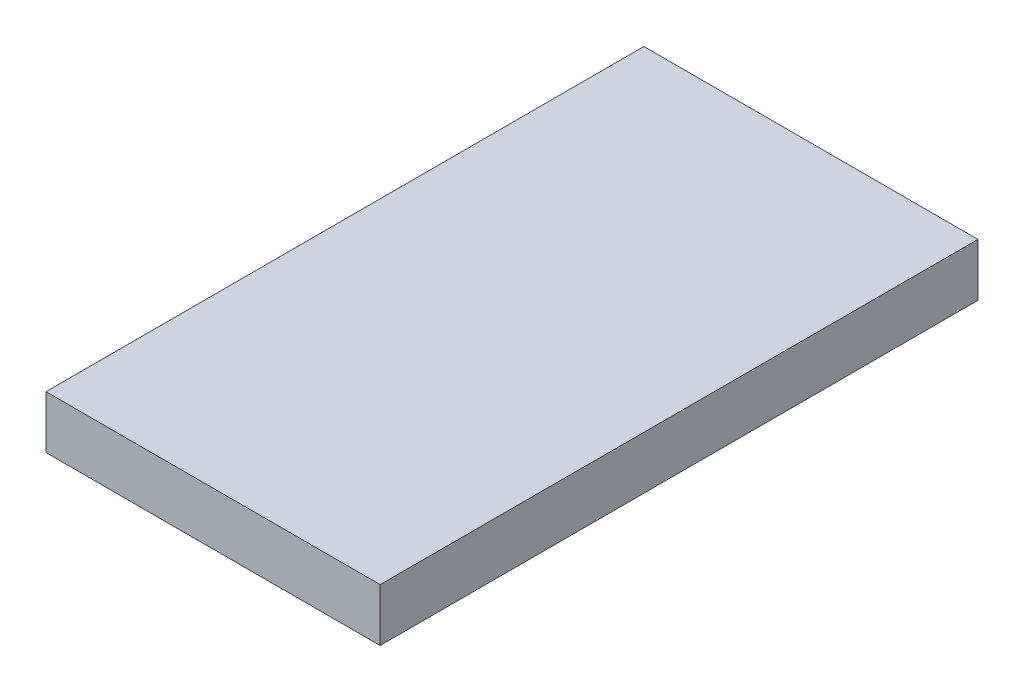
ISO-10303-21;
HEADER;
FILE_DESCRIPTION(('STEP AP214'),'2;1');
FILE_NAME('part.step','',(''),(''),'','','');
FILE_SCHEMA(('AUTOMOTIVE_DESIGN { 1 0 10303 214 1 1 1 1 }'));
ENDSEC;
DATA;
#1=APPLICATION_CONTEXT('core data for automotive mechanical design processes');
#2=APPLICATION_PROTOCOL_DEFINITION('international standard','automotive_design',2000,#1);
#3=PRODUCT_CONTEXT('',#1,'mechanical');
#4=PRODUCT('Part','Part','',(#3));
#5=PRODUCT_RELATED_PRODUCT_CATEGORY('part','',(#4));
#6=PRODUCT_DEFINITION_FORMATION('','',#4);
#7=PRODUCT_DEFINITION_CONTEXT('part definition',#1,'design');
#8=PRODUCT_DEFINITION('design','',#6,#7);
#9=PRODUCT_DEFINITION_SHAPE('','',#8);
#10=(LENGTH_UNIT() NAMED_UNIT(*) SI_UNIT(.MILLI.,.METRE.));
#11=(NAMED_UNIT(*) PLANE_ANGLE_UNIT() SI_UNIT($,.RADIAN.));
#12=(NAMED_UNIT(*) SI_UNIT($,.STERADIAN.) SOLID_ANGLE_UNIT());
#13=UNCERTAINTY_MEASURE_WITH_UNIT(LENGTH_MEASURE(1.E-05),#10,'distance_accuracy_value','');
#14=(GEOMETRIC_REPRESENTATION_CONTEXT(3) GLOBAL_UNCERTAINTY_ASSIGNED_CONTEXT((#13)) GLOBAL_UNIT_ASSIGNED_CONTEXT((#10,
#11,#12)) REPRESENTATION_CONTEXT('',''));
#15=CARTESIAN_POINT('',(0.,0.,0.));
#16=DIRECTION('',(0.,0.,1.));
#17=DIRECTION('',(1.,0.,0.));
#18=AXIS2_PLACEMENT_3D('',#15,#16,#17);
#19=CARTESIAN_POINT('',(0.,19.05,0.));
#20=DIRECTION('',(1.,0.,0.));
#21=DIRECTION('',(0.,0.,-1.));
#22=AXIS2_PLACEMENT_3D('',#19,#20,#21);
#23=PLANE('',#22);
#24=DIRECTION('',(0.,0.,1.));
#25=VECTOR('',#24,1.);
#26=CARTESIAN_POINT('',(0.,0.,0.));
#27=LINE('',#26,#25);
#28=CARTESIAN_POINT('',(0.,0.,-215.9));
#29=VERTEX_POINT('',#28);
#30=CARTESIAN_POINT('',(0.,0.,0.));
#31=VERTEX_POINT('',#30);
#32=EDGE_CURVE('E96',#29,#31,#27,.T.);
#33=ORIENTED_EDGE('',*,*,#32,.T.);
#34=DIRECTION('',(0.,-1.,0.));
#35=VECTOR('',#34,1.);
#36=CARTESIAN_POINT('',(0.,19.05,0.));
#37=LINE('',#36,#35);
#38=CARTESIAN_POINT('',(0.,19.05,0.));
#39=VERTEX_POINT('',#38);
#40=EDGE_CURVE('E11',#39,#31,#37,.T.);
#41=ORIENTED_EDGE('',*,*,#40,.F.);
#42=DIRECTION('',(0.,0.,1.));
#43=VECTOR('',#42,1.);
#44=CARTESIAN_POINT('',(0.,19.05,0.));
#45=LINE('',#44,#43);
#46=CARTESIAN_POINT('',(0.,19.05,-215.9));
#47=VERTEX_POINT('',#46);
#48=EDGE_CURVE('E84',#47,#39,#45,.T.);
#49=ORIENTED_EDGE('',*,*,#48,.F.);
#50=DIRECTION('',(0.,-1.,0.));
#51=VECTOR('',#50,1.);
#52=CARTESIAN_POINT('',(0.,19.05,-215.9));
#53=LINE('',#52,#51);
#54=EDGE_CURVE('E92',#47,#29,#53,.T.);
#55=ORIENTED_EDGE('',*,*,#54,.T.);
#56=EDGE_LOOP('',(#33,#41,#49,#55));
#57=FACE_BOUND('',#56,.T.);
#58=ADVANCED_FACE('F33',(#57),#23,.F.);
#59=CARTESIAN_POINT('',(0.,19.05,0.));
#60=DIRECTION('',(0.,0.,-1.));
#61=DIRECTION('',(-1.,0.,0.));
#62=AXIS2_PLACEMENT_3D('',#59,#60,#61);
#63=PLANE('',#62);
#64=DIRECTION('',(1.,0.,0.));
#65=VECTOR('',#64,1.);
#66=CARTESIAN_POINT('',(0.,0.,0.));
#67=LINE('',#66,#65);
#68=CARTESIAN_POINT('',(120.65,0.,0.));
#69=VERTEX_POINT('',#68);
#70=EDGE_CURVE('E88',#31,#69,#67,.T.);
#71=ORIENTED_EDGE('',*,*,#70,.T.);
#72=DIRECTION('',(0.,-1.,0.));
#73=VECTOR('',#72,1.);
#74=CARTESIAN_POINT('',(120.65,19.05,0.));
#75=LINE('',#74,#73);
#76=CARTESIAN_POINT('',(120.65,19.05,0.));
#77=VERTEX_POINT('',#76);
#78=EDGE_CURVE('E41',#77,#69,#75,.T.);
#79=ORIENTED_EDGE('',*,*,#78,.F.);
#80=DIRECTION('',(1.,0.,0.));
#81=VECTOR('',#80,1.);
#82=CARTESIAN_POINT('',(0.,19.05,0.));
#83=LINE('',#82,#81);
#84=EDGE_CURVE('E79',#39,#77,#83,.T.);
#85=ORIENTED_EDGE('',*,*,#84,.F.);
#86=ORIENTED_EDGE('',*,*,#40,.T.);
#87=EDGE_LOOP('',(#71,#79,#85,#86));
#88=FACE_BOUND('',#87,.T.);
#89=ADVANCED_FACE('F87',(#88),#63,.F.);
#90=CARTESIAN_POINT('',(120.65,19.05,0.));
#91=DIRECTION('',(-1.,0.,0.));
#92=DIRECTION('',(0.,0.,1.));
#93=AXIS2_PLACEMENT_3D('',#90,#91,#92);
#94=PLANE('',#93);
#95=DIRECTION('',(0.,0.,-1.));
#96=VECTOR('',#95,1.);
#97=CARTESIAN_POINT('',(120.65,0.,0.));
#98=LINE('',#97,#96);
#99=CARTESIAN_POINT('',(120.65,0.,-215.9));
#100=VERTEX_POINT('',#99);
#101=EDGE_CURVE('E66',#69,#100,#98,.T.);
#102=ORIENTED_EDGE('',*,*,#101,.T.);
#103=DIRECTION('',(0.,-1.,0.));
#104=VECTOR('',#103,1.);
#105=CARTESIAN_POINT('',(120.65,19.05,-215.9));
#106=LINE('',#105,#104);
#107=CARTESIAN_POINT('',(120.65,19.05,-215.9));
#108=VERTEX_POINT('',#107);
#109=EDGE_CURVE('E89',#108,#100,#106,.T.);
#110=ORIENTED_EDGE('',*,*,#109,.F.);
#111=DIRECTION('',(0.,0.,-1.));
#112=VECTOR('',#111,1.);
#113=CARTESIAN_POINT('',(120.65,19.05,0.));
#114=LINE('',#113,#112);
#115=EDGE_CURVE('E82',#77,#108,#114,.T.);
#116=ORIENTED_EDGE('',*,*,#115,.F.);
#117=ORIENTED_EDGE('',*,*,#78,.T.);
#118=EDGE_LOOP('',(#102,#110,#116,#117));
#119=FACE_BOUND('',#118,.T.);
#120=ADVANCED_FACE('F90',(#119),#94,.F.);
#121=CARTESIAN_POINT('',(0.,19.05,-215.9));
#122=DIRECTION('',(0.,0.,1.));
#123=DIRECTION('',(1.,0.,0.));
#124=AXIS2_PLACEMENT_3D('',#121,#122,#123);
#125=PLANE('',#124);
#126=DIRECTION('',(-1.,0.,0.));
#127=VECTOR('',#126,1.);
#128=CARTESIAN_POINT('',(0.,0.,-215.9));
#129=LINE('',#128,#127);
#130=EDGE_CURVE('E72',#100,#29,#129,.T.);
#131=ORIENTED_EDGE('',*,*,#130,.T.);
#132=ORIENTED_EDGE('',*,*,#54,.F.);
#133=DIRECTION('',(-1.,0.,0.));
#134=VECTOR('',#133,1.);
#135=CARTESIAN_POINT('',(0.,19.05,-215.9));
#136=LINE('',#135,#134);
#137=EDGE_CURVE('E49',#108,#47,#136,.T.);
#138=ORIENTED_EDGE('',*,*,#137,.F.);
#139=ORIENTED_EDGE('',*,*,#109,.T.);
#140=EDGE_LOOP('',(#131,#132,#138,#139));
#141=FACE_BOUND('',#140,.T.);
#142=ADVANCED_FACE('F103',(#141),#125,.F.);
#143=CARTESIAN_POINT('',(0.,19.05,0.));
#144=DIRECTION('',(0.,-1.,0.));
#145=DIRECTION('',(0.,0.,-1.));
#146=AXIS2_PLACEMENT_3D('',#143,#144,#145);
#147=PLANE('',#146);
#148=ORIENTED_EDGE('',*,*,#48,.T.);
#149=ORIENTED_EDGE('',*,*,#84,.T.);
#150=ORIENTED_EDGE('',*,*,#115,.T.);
#151=ORIENTED_EDGE('',*,*,#137,.T.);
#152=EDGE_LOOP('',(#148,#149,#150,#151));
#153=FACE_BOUND('',#152,.T.);
#154=ADVANCED_FACE('F80',(#153),#147,.F.);
#155=CARTESIAN_POINT('',(0.,0.,0.));
#156=DIRECTION('',(0.,-1.,0.));
#157=DIRECTION('',(0.,0.,-1.));
#158=AXIS2_PLACEMENT_3D('',#155,#156,#157);
#159=PLANE('',#158);
#160=ORIENTED_EDGE('',*,*,#32,.F.);
#161=ORIENTED_EDGE('',*,*,#130,.F.);
#162=ORIENTED_EDGE('',*,*,#101,.F.);
#163=ORIENTED_EDGE('',*,*,#70,.F.);
#164=EDGE_LOOP('',(#160,#161,#162,#163));
#165=FACE_BOUND('',#164,.T.);
#166=ADVANCED_FACE('F106',(#165),#159,.T.);
#167=CLOSED_SHELL('',(#58,#89,#120,#142,#154,#166));
#168=MANIFOLD_SOLID_BREP('B2',#167);
#169=ADVANCED_BREP_SHAPE_REPRESENTATION('',(#18,#168),#14);
#170=SHAPE_DEFINITION_REPRESENTATION(#9,#169);
ENDSEC;
END-ISO-10303-21;
